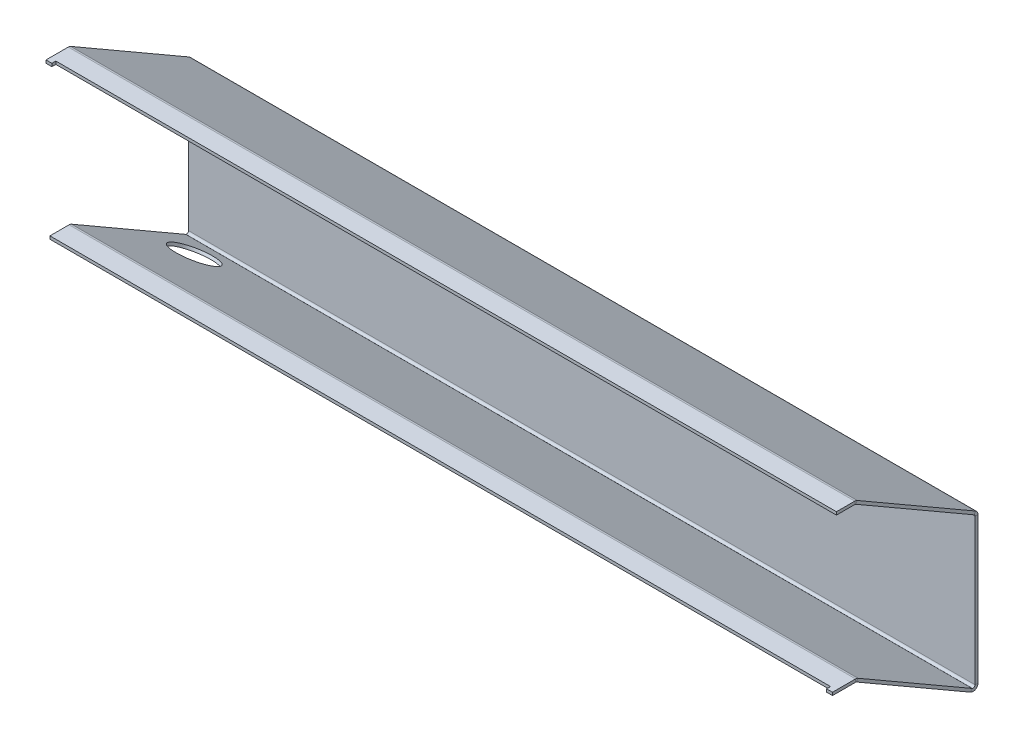
ISO-10303-21;
HEADER;
FILE_DESCRIPTION(('STEP AP214'),'2;1');
FILE_NAME('part.step','',(''),(''),'','','');
FILE_SCHEMA(('AUTOMOTIVE_DESIGN { 1 0 10303 214 1 1 1 1 }'));
ENDSEC;
DATA;
#1=APPLICATION_CONTEXT('core data for automotive mechanical design processes');
#2=APPLICATION_PROTOCOL_DEFINITION('international standard','automotive_design',2000,#1);
#3=PRODUCT_CONTEXT('',#1,'mechanical');
#4=PRODUCT('Part','Part','',(#3));
#5=PRODUCT_RELATED_PRODUCT_CATEGORY('part','',(#4));
#6=PRODUCT_DEFINITION_FORMATION('','',#4);
#7=PRODUCT_DEFINITION_CONTEXT('part definition',#1,'design');
#8=PRODUCT_DEFINITION('design','',#6,#7);
#9=PRODUCT_DEFINITION_SHAPE('','',#8);
#10=(LENGTH_UNIT() NAMED_UNIT(*) SI_UNIT(.MILLI.,.METRE.));
#11=(NAMED_UNIT(*) PLANE_ANGLE_UNIT() SI_UNIT($,.RADIAN.));
#12=(NAMED_UNIT(*) SI_UNIT($,.STERADIAN.) SOLID_ANGLE_UNIT());
#13=UNCERTAINTY_MEASURE_WITH_UNIT(LENGTH_MEASURE(1.E-05),#10,'distance_accuracy_value','');
#14=(GEOMETRIC_REPRESENTATION_CONTEXT(3) GLOBAL_UNCERTAINTY_ASSIGNED_CONTEXT((#13)) GLOBAL_UNIT_ASSIGNED_CONTEXT((#10,
#11,#12)) REPRESENTATION_CONTEXT('',''));
#15=CARTESIAN_POINT('',(0.,0.,0.));
#16=DIRECTION('',(0.,0.,1.));
#17=DIRECTION('',(1.,0.,0.));
#18=AXIS2_PLACEMENT_3D('',#15,#16,#17);
#19=CARTESIAN_POINT('',(-400.,0.,22.3567994977189));
#20=DIRECTION('',(0.,0.,-1.));
#21=DIRECTION('',(-1.,0.,0.));
#22=AXIS2_PLACEMENT_3D('',#19,#20,#21);
#23=PLANE('',#22);
#24=DIRECTION('',(0.,-1.,0.));
#25=VECTOR('',#24,1.);
#26=CARTESIAN_POINT('',(-3.,0.,22.3567994977189));
#27=LINE('',#26,#25);
#28=CARTESIAN_POINT('',(-3.,1.5,22.3567994977189));
#29=VERTEX_POINT('',#28);
#30=CARTESIAN_POINT('',(-3.,0.,22.3567994977189));
#31=VERTEX_POINT('',#30);
#32=EDGE_CURVE('E52',#29,#31,#27,.T.);
#33=ORIENTED_EDGE('',*,*,#32,.F.);
#34=DIRECTION('',(1.,0.,0.));
#35=VECTOR('',#34,1.);
#36=CARTESIAN_POINT('',(-400.,1.5,22.3567994977189));
#37=LINE('',#36,#35);
#38=CARTESIAN_POINT('',(-400.,1.5,22.3567994977189));
#39=VERTEX_POINT('',#38);
#40=EDGE_CURVE('E387',#39,#29,#37,.T.);
#41=ORIENTED_EDGE('',*,*,#40,.F.);
#42=DIRECTION('',(0.,1.,0.));
#43=VECTOR('',#42,1.);
#44=CARTESIAN_POINT('',(-400.,0.,22.3567994977189));
#45=LINE('',#44,#43);
#46=CARTESIAN_POINT('',(-400.,0.,22.3567994977189));
#47=VERTEX_POINT('',#46);
#48=EDGE_CURVE('E284',#47,#39,#45,.T.);
#49=ORIENTED_EDGE('',*,*,#48,.F.);
#50=DIRECTION('',(1.,0.,0.));
#51=VECTOR('',#50,1.);
#52=CARTESIAN_POINT('',(-400.,0.,22.3567994977189));
#53=LINE('',#52,#51);
#54=EDGE_CURVE('E385',#47,#31,#53,.T.);
#55=ORIENTED_EDGE('',*,*,#54,.T.);
#56=EDGE_LOOP('',(#33,#41,#49,#55));
#57=FACE_BOUND('',#56,.T.);
#58=ADVANCED_FACE('F37',(#57),#23,.F.);
#59=CARTESIAN_POINT('',(-400.,78.5,22.3567994977189));
#60=DIRECTION('',(0.,0.,-1.));
#61=DIRECTION('',(-1.,0.,0.));
#62=AXIS2_PLACEMENT_3D('',#59,#60,#61);
#63=PLANE('',#62);
#64=DIRECTION('',(0.,1.,0.));
#65=VECTOR('',#64,1.);
#66=CARTESIAN_POINT('',(-397.,80.,22.3567994977189));
#67=LINE('',#66,#65);
#68=CARTESIAN_POINT('',(-397.,78.5,22.3567994977189));
#69=VERTEX_POINT('',#68);
#70=CARTESIAN_POINT('',(-397.,80.,22.3567994977189));
#71=VERTEX_POINT('',#70);
#72=EDGE_CURVE('E60',#69,#71,#67,.T.);
#73=ORIENTED_EDGE('',*,*,#72,.F.);
#74=DIRECTION('',(1.,0.,0.));
#75=VECTOR('',#74,1.);
#76=CARTESIAN_POINT('',(-400.,78.5,22.3567994977189));
#77=LINE('',#76,#75);
#78=CARTESIAN_POINT('',(0.,78.5,22.3567994977189));
#79=VERTEX_POINT('',#78);
#80=EDGE_CURVE('E412',#69,#79,#77,.T.);
#81=ORIENTED_EDGE('',*,*,#80,.T.);
#82=DIRECTION('',(0.,1.,0.));
#83=VECTOR('',#82,1.);
#84=CARTESIAN_POINT('',(0.,78.5,22.3567994977189));
#85=LINE('',#84,#83);
#86=CARTESIAN_POINT('',(0.,80.,22.3567994977189));
#87=VERTEX_POINT('',#86);
#88=EDGE_CURVE('E313',#79,#87,#85,.T.);
#89=ORIENTED_EDGE('',*,*,#88,.T.);
#90=DIRECTION('',(1.,0.,0.));
#91=VECTOR('',#90,1.);
#92=CARTESIAN_POINT('',(-400.,80.,22.3567994977189));
#93=LINE('',#92,#91);
#94=EDGE_CURVE('E310',#71,#87,#93,.T.);
#95=ORIENTED_EDGE('',*,*,#94,.F.);
#96=EDGE_LOOP('',(#73,#81,#89,#95));
#97=FACE_BOUND('',#96,.T.);
#98=ADVANCED_FACE('F529',(#97),#63,.F.);
#99=CARTESIAN_POINT('',(-400.,-0.133974596215558,12.12474869015));
#100=DIRECTION('',(-1.,0.,0.));
#101=DIRECTION('',(0.,0.,1.));
#102=AXIS2_PLACEMENT_3D('',#99,#100,#101);
#103=PLANE('',#102);
#104=DIRECTION('',(0.,0.86602540378444,-0.499999999999997));
#105=VECTOR('',#104,1.);
#106=CARTESIAN_POINT('',(-400.,-0.133974596215558,12.12474869015));
#107=LINE('',#106,#105);
#108=CARTESIAN_POINT('',(-400.,-0.133974596215558,12.12474869015));
#109=VERTEX_POINT('',#108);
#110=CARTESIAN_POINT('',(-400.,1.1650635094611,11.37474869015));
#111=VERTEX_POINT('',#110);
#112=EDGE_CURVE('E11',#109,#111,#107,.T.);
#113=ORIENTED_EDGE('',*,*,#112,.F.);
#114=CARTESIAN_POINT('',(-400.,-0.999999999999999,12.62474869015));
#115=DIRECTION('',(1.,0.,0.));
#116=DIRECTION('',(0.,0.,-1.));
#117=AXIS2_PLACEMENT_3D('',#114,#115,#116);
#118=CIRCLE('',#117,1.);
#119=CARTESIAN_POINT('',(-400.,0.,12.62474869015));
#120=VERTEX_POINT('',#119);
#121=EDGE_CURVE('E289',#120,#109,#118,.F.);
#122=ORIENTED_EDGE('',*,*,#121,.F.);
#123=DIRECTION('',(0.,-1.,0.));
#124=VECTOR('',#123,1.);
#125=CARTESIAN_POINT('',(-400.,1.5,12.62474869015));
#126=LINE('',#125,#124);
#127=CARTESIAN_POINT('',(-400.,1.5,12.62474869015));
#128=VERTEX_POINT('',#127);
#129=EDGE_CURVE('E45',#128,#120,#126,.T.);
#130=ORIENTED_EDGE('',*,*,#129,.F.);
#131=CARTESIAN_POINT('',(-400.,-0.999999999999999,12.62474869015));
#132=DIRECTION('',(1.,0.,0.));
#133=DIRECTION('',(0.,0.,-1.));
#134=AXIS2_PLACEMENT_3D('',#131,#132,#133);
#135=CIRCLE('',#134,2.5);
#136=EDGE_CURVE('E278',#128,#111,#135,.F.);
#137=ORIENTED_EDGE('',*,*,#136,.T.);
#138=EDGE_LOOP('',(#113,#122,#130,#137));
#139=FACE_BOUND('',#138,.T.);
#140=ADVANCED_FACE('F39',(#139),#103,.T.);
#141=CARTESIAN_POINT('',(-400.,1.5,12.62474869015));
#142=DIRECTION('',(-1.,0.,0.));
#143=DIRECTION('',(0.,0.,1.));
#144=AXIS2_PLACEMENT_3D('',#141,#142,#143);
#145=PLANE('',#144);
#146=DIRECTION('',(0.,-0.499999999999998,-0.86602540378444));
#147=VECTOR('',#146,1.);
#148=CARTESIAN_POINT('',(-400.,0.,12.3567994977189));
#149=LINE('',#148,#147);
#150=CARTESIAN_POINT('',(-400.,-33.6306531802955,-45.8932005022811));
#151=VERTEX_POINT('',#150);
#152=EDGE_CURVE('E292',#109,#151,#149,.T.);
#153=ORIENTED_EDGE('',*,*,#152,.F.);
#154=ORIENTED_EDGE('',*,*,#112,.T.);
#155=DIRECTION('',(0.,-0.499999999999998,-0.86602540378444));
#156=VECTOR('',#155,1.);
#157=CARTESIAN_POINT('',(-400.,1.29903810567666,11.6067994977189));
#158=LINE('',#157,#156);
#159=CARTESIAN_POINT('',(-400.,-32.3316150746188,-46.6432005022811));
#160=VERTEX_POINT('',#159);
#161=EDGE_CURVE('E275',#111,#160,#158,.T.);
#162=ORIENTED_EDGE('',*,*,#161,.T.);
#163=DIRECTION('',(0.,-0.86602540378444,0.499999999999997));
#164=VECTOR('',#163,1.);
#165=CARTESIAN_POINT('',(-400.,-32.3316150746188,-46.6432005022811));
#166=LINE('',#165,#164);
#167=EDGE_CURVE('E434',#160,#151,#166,.T.);
#168=ORIENTED_EDGE('',*,*,#167,.T.);
#169=EDGE_LOOP('',(#153,#154,#162,#168));
#170=FACE_BOUND('',#169,.T.);
#171=ADVANCED_FACE('F468',(#170),#145,.T.);
#172=CARTESIAN_POINT('',(0.,0.,12.62474869015));
#173=DIRECTION('',(1.,0.,0.));
#174=DIRECTION('',(0.,0.,-1.));
#175=AXIS2_PLACEMENT_3D('',#172,#173,#174);
#176=PLANE('',#175);
#177=DIRECTION('',(0.,1.,0.));
#178=VECTOR('',#177,1.);
#179=CARTESIAN_POINT('',(0.,0.,12.62474869015));
#180=LINE('',#179,#178);
#181=CARTESIAN_POINT('',(0.,0.,12.62474869015));
#182=VERTEX_POINT('',#181);
#183=CARTESIAN_POINT('',(0.,1.5,12.62474869015));
#184=VERTEX_POINT('',#183);
#185=EDGE_CURVE('E204',#182,#184,#180,.T.);
#186=ORIENTED_EDGE('',*,*,#185,.F.);
#187=CARTESIAN_POINT('',(0.,-0.999999999999999,12.62474869015));
#188=DIRECTION('',(1.,0.,0.));
#189=DIRECTION('',(0.,0.,-1.));
#190=AXIS2_PLACEMENT_3D('',#187,#188,#189);
#191=CIRCLE('',#190,1.);
#192=CARTESIAN_POINT('',(0.,-0.133974596215558,12.12474869015));
#193=VERTEX_POINT('',#192);
#194=EDGE_CURVE('E340',#182,#193,#191,.F.);
#195=ORIENTED_EDGE('',*,*,#194,.T.);
#196=DIRECTION('',(0.,-0.86602540378444,0.499999999999997));
#197=VECTOR('',#196,1.);
#198=CARTESIAN_POINT('',(0.,1.1650635094611,11.37474869015));
#199=LINE('',#198,#197);
#200=CARTESIAN_POINT('',(0.,1.1650635094611,11.37474869015));
#201=VERTEX_POINT('',#200);
#202=EDGE_CURVE('E438',#201,#193,#199,.T.);
#203=ORIENTED_EDGE('',*,*,#202,.F.);
#204=CARTESIAN_POINT('',(0.,-0.999999999999999,12.62474869015));
#205=DIRECTION('',(1.,0.,0.));
#206=DIRECTION('',(0.,0.,-1.));
#207=AXIS2_PLACEMENT_3D('',#204,#205,#206);
#208=CIRCLE('',#207,2.5);
#209=EDGE_CURVE('E209',#184,#201,#208,.F.);
#210=ORIENTED_EDGE('',*,*,#209,.F.);
#211=EDGE_LOOP('',(#186,#195,#203,#210));
#212=FACE_BOUND('',#211,.T.);
#213=ADVANCED_FACE('F476',(#212),#176,.T.);
#214=CARTESIAN_POINT('',(0.,1.1650635094611,11.37474869015));
#215=DIRECTION('',(1.,0.,0.));
#216=DIRECTION('',(0.,0.,-1.));
#217=AXIS2_PLACEMENT_3D('',#214,#215,#216);
#218=PLANE('',#217);
#219=DIRECTION('',(0.,0.,-1.));
#220=VECTOR('',#219,1.);
#221=CARTESIAN_POINT('',(0.,0.,12.3567994977189));
#222=LINE('',#221,#220);
#223=CARTESIAN_POINT('',(0.,0.,24.3567994977189));
#224=VERTEX_POINT('',#223);
#225=EDGE_CURVE('E208',#224,#182,#222,.T.);
#226=ORIENTED_EDGE('',*,*,#225,.T.);
#227=ORIENTED_EDGE('',*,*,#185,.T.);
#228=DIRECTION('',(0.,0.,-1.));
#229=VECTOR('',#228,1.);
#230=CARTESIAN_POINT('',(0.,1.5,12.3567994977189));
#231=LINE('',#230,#229);
#232=CARTESIAN_POINT('',(0.,1.5,24.3567994977189));
#233=VERTEX_POINT('',#232);
#234=EDGE_CURVE('E198',#233,#184,#231,.T.);
#235=ORIENTED_EDGE('',*,*,#234,.F.);
#236=DIRECTION('',(0.,1.,0.));
#237=VECTOR('',#236,1.);
#238=CARTESIAN_POINT('',(0.,0.,24.3567994977189));
#239=LINE('',#238,#237);
#240=EDGE_CURVE('E203',#224,#233,#239,.T.);
#241=ORIENTED_EDGE('',*,*,#240,.F.);
#242=EDGE_LOOP('',(#226,#227,#235,#241));
#243=FACE_BOUND('',#242,.T.);
#244=ADVANCED_FACE('F201',(#243),#218,.T.);
#245=CARTESIAN_POINT('',(-400.,-31.4655896708344,-49.6432005022811));
#246=DIRECTION('',(-1.,0.,0.));
#247=DIRECTION('',(0.,0.,1.));
#248=AXIS2_PLACEMENT_3D('',#245,#246,#247);
#249=PLANE('',#248);
#250=DIRECTION('',(0.,0.,1.));
#251=VECTOR('',#250,1.);
#252=CARTESIAN_POINT('',(-400.,-31.4655896708344,-49.6432005022811));
#253=LINE('',#252,#251);
#254=CARTESIAN_POINT('',(-400.,-31.4655896708344,-49.6432005022811));
#255=VERTEX_POINT('',#254);
#256=CARTESIAN_POINT('',(-400.,-31.4655896708344,-48.1432005022811));
#257=VERTEX_POINT('',#256);
#258=EDGE_CURVE('E436',#255,#257,#253,.T.);
#259=ORIENTED_EDGE('',*,*,#258,.F.);
#260=CARTESIAN_POINT('',(-400.,-31.4655896708344,-47.1432005022811));
#261=DIRECTION('',(-1.,0.,0.));
#262=DIRECTION('',(0.,0.,1.));
#263=AXIS2_PLACEMENT_3D('',#260,#261,#262);
#264=CIRCLE('',#263,2.5);
#265=EDGE_CURVE('E295',#151,#255,#264,.F.);
#266=ORIENTED_EDGE('',*,*,#265,.F.);
#267=ORIENTED_EDGE('',*,*,#167,.F.);
#268=CARTESIAN_POINT('',(-400.,-31.4655896708344,-47.1432005022811));
#269=DIRECTION('',(1.,0.,0.));
#270=DIRECTION('',(0.,0.,-1.));
#271=AXIS2_PLACEMENT_3D('',#268,#269,#270);
#272=CIRCLE('',#271,1.);
#273=EDGE_CURVE('E272',#160,#257,#272,.T.);
#274=ORIENTED_EDGE('',*,*,#273,.T.);
#275=EDGE_LOOP('',(#259,#266,#267,#274));
#276=FACE_BOUND('',#275,.T.);
#277=ADVANCED_FACE('F519',(#276),#249,.T.);
#278=CARTESIAN_POINT('',(-400.,-32.3316150746188,-46.6432005022811));
#279=DIRECTION('',(-1.,0.,0.));
#280=DIRECTION('',(0.,0.,1.));
#281=AXIS2_PLACEMENT_3D('',#278,#279,#280);
#282=PLANE('',#281);
#283=DIRECTION('',(0.,1.,0.));
#284=VECTOR('',#283,1.);
#285=CARTESIAN_POINT('',(-400.,-35.7957166897566,-49.6432005022811));
#286=LINE('',#285,#284);
#287=CARTESIAN_POINT('',(-400.,42.7609076372694,-49.6432005022811));
#288=VERTEX_POINT('',#287);
#289=EDGE_CURVE('E298',#255,#288,#286,.T.);
#290=ORIENTED_EDGE('',*,*,#289,.F.);
#291=ORIENTED_EDGE('',*,*,#258,.T.);
#292=DIRECTION('',(0.,1.,0.));
#293=VECTOR('',#292,1.);
#294=CARTESIAN_POINT('',(-400.,-35.7957166897566,-48.1432005022811));
#295=LINE('',#294,#293);
#296=CARTESIAN_POINT('',(-400.,42.7609076372694,-48.1432005022811));
#297=VERTEX_POINT('',#296);
#298=EDGE_CURVE('E269',#257,#297,#295,.T.);
#299=ORIENTED_EDGE('',*,*,#298,.T.);
#300=DIRECTION('',(0.,0.,-1.));
#301=VECTOR('',#300,1.);
#302=CARTESIAN_POINT('',(-400.,42.7609076372694,-48.1432005022811));
#303=LINE('',#302,#301);
#304=EDGE_CURVE('E426',#297,#288,#303,.T.);
#305=ORIENTED_EDGE('',*,*,#304,.T.);
#306=EDGE_LOOP('',(#290,#291,#299,#305));
#307=FACE_BOUND('',#306,.T.);
#308=ADVANCED_FACE('F517',(#307),#282,.T.);
#309=CARTESIAN_POINT('',(0.,-33.6306531802955,-45.8932005022811));
#310=DIRECTION('',(1.,0.,0.));
#311=DIRECTION('',(0.,0.,-1.));
#312=AXIS2_PLACEMENT_3D('',#309,#310,#311);
#313=PLANE('',#312);
#314=DIRECTION('',(0.,0.86602540378444,-0.499999999999997));
#315=VECTOR('',#314,1.);
#316=CARTESIAN_POINT('',(0.,-33.6306531802955,-45.8932005022811));
#317=LINE('',#316,#315);
#318=CARTESIAN_POINT('',(0.,-33.6306531802955,-45.8932005022811));
#319=VERTEX_POINT('',#318);
#320=CARTESIAN_POINT('',(0.,-32.3316150746188,-46.6432005022811));
#321=VERTEX_POINT('',#320);
#322=EDGE_CURVE('E432',#319,#321,#317,.T.);
#323=ORIENTED_EDGE('',*,*,#322,.F.);
#324=CARTESIAN_POINT('',(0.,-31.4655896708344,-47.1432005022811));
#325=DIRECTION('',(-1.,0.,0.));
#326=DIRECTION('',(0.,0.,1.));
#327=AXIS2_PLACEMENT_3D('',#324,#325,#326);
#328=CIRCLE('',#327,2.5);
#329=CARTESIAN_POINT('',(0.,-31.4655896708344,-49.6432005022811));
#330=VERTEX_POINT('',#329);
#331=EDGE_CURVE('E346',#319,#330,#328,.F.);
#332=ORIENTED_EDGE('',*,*,#331,.T.);
#333=DIRECTION('',(0.,0.,-1.));
#334=VECTOR('',#333,1.);
#335=CARTESIAN_POINT('',(0.,-31.4655896708344,-48.1432005022811));
#336=LINE('',#335,#334);
#337=CARTESIAN_POINT('',(0.,-31.4655896708344,-48.1432005022811));
#338=VERTEX_POINT('',#337);
#339=EDGE_CURVE('E430',#338,#330,#336,.T.);
#340=ORIENTED_EDGE('',*,*,#339,.F.);
#341=CARTESIAN_POINT('',(0.,-31.4655896708344,-47.1432005022811));
#342=DIRECTION('',(1.,0.,0.));
#343=DIRECTION('',(0.,0.,-1.));
#344=AXIS2_PLACEMENT_3D('',#341,#342,#343);
#345=CIRCLE('',#344,1.);
#346=EDGE_CURVE('E331',#321,#338,#345,.T.);
#347=ORIENTED_EDGE('',*,*,#346,.F.);
#348=EDGE_LOOP('',(#323,#332,#340,#347));
#349=FACE_BOUND('',#348,.T.);
#350=ADVANCED_FACE('F483',(#349),#313,.T.);
#351=CARTESIAN_POINT('',(0.,-31.4655896708344,-48.1432005022811));
#352=DIRECTION('',(1.,0.,0.));
#353=DIRECTION('',(0.,0.,-1.));
#354=AXIS2_PLACEMENT_3D('',#351,#352,#353);
#355=PLANE('',#354);
#356=DIRECTION('',(0.,-0.499999999999998,-0.86602540378444));
#357=VECTOR('',#356,1.);
#358=CARTESIAN_POINT('',(0.,0.,12.3567994977189));
#359=LINE('',#358,#357);
#360=EDGE_CURVE('E343',#193,#319,#359,.T.);
#361=ORIENTED_EDGE('',*,*,#360,.T.);
#362=ORIENTED_EDGE('',*,*,#322,.T.);
#363=DIRECTION('',(0.,-0.499999999999998,-0.86602540378444));
#364=VECTOR('',#363,1.);
#365=CARTESIAN_POINT('',(0.,1.29903810567666,11.6067994977189));
#366=LINE('',#365,#364);
#367=EDGE_CURVE('E334',#201,#321,#366,.T.);
#368=ORIENTED_EDGE('',*,*,#367,.F.);
#369=ORIENTED_EDGE('',*,*,#202,.T.);
#370=EDGE_LOOP('',(#361,#362,#368,#369));
#371=FACE_BOUND('',#370,.T.);
#372=ADVANCED_FACE('F477',(#371),#355,.T.);
#373=CARTESIAN_POINT('',(-400.,44.9259711467305,-48.3932005022811));
#374=DIRECTION('',(-1.,0.,0.));
#375=DIRECTION('',(0.,0.,1.));
#376=AXIS2_PLACEMENT_3D('',#373,#374,#375);
#377=PLANE('',#376);
#378=DIRECTION('',(0.,-0.86602540378444,0.499999999999997));
#379=VECTOR('',#378,1.);
#380=CARTESIAN_POINT('',(-400.,44.9259711467305,-48.3932005022811));
#381=LINE('',#380,#379);
#382=CARTESIAN_POINT('',(-400.,44.9259711467305,-48.3932005022811));
#383=VERTEX_POINT('',#382);
#384=CARTESIAN_POINT('',(-400.,43.6269330410538,-47.6432005022811));
#385=VERTEX_POINT('',#384);
#386=EDGE_CURVE('E428',#383,#385,#381,.T.);
#387=ORIENTED_EDGE('',*,*,#386,.F.);
#388=CARTESIAN_POINT('',(-400.,42.7609076372694,-47.1432005022811));
#389=DIRECTION('',(-1.,0.,0.));
#390=DIRECTION('',(0.,0.,1.));
#391=AXIS2_PLACEMENT_3D('',#388,#389,#390);
#392=CIRCLE('',#391,2.5);
#393=EDGE_CURVE('E301',#288,#383,#392,.F.);
#394=ORIENTED_EDGE('',*,*,#393,.F.);
#395=ORIENTED_EDGE('',*,*,#304,.F.);
#396=CARTESIAN_POINT('',(-400.,42.7609076372694,-47.1432005022811));
#397=DIRECTION('',(1.,0.,0.));
#398=DIRECTION('',(0.,0.,-1.));
#399=AXIS2_PLACEMENT_3D('',#396,#397,#398);
#400=CIRCLE('',#399,1.);
#401=EDGE_CURVE('E266',#297,#385,#400,.T.);
#402=ORIENTED_EDGE('',*,*,#401,.T.);
#403=EDGE_LOOP('',(#387,#394,#395,#402));
#404=FACE_BOUND('',#403,.T.);
#405=ADVANCED_FACE('F515',(#404),#377,.T.);
#406=CARTESIAN_POINT('',(-400.,42.7609076372694,-48.1432005022811));
#407=DIRECTION('',(-1.,0.,0.));
#408=DIRECTION('',(0.,0.,1.));
#409=AXIS2_PLACEMENT_3D('',#406,#407,#408);
#410=PLANE('',#409);
#411=DIRECTION('',(0.,0.499999999999998,0.86602540378444));
#412=VECTOR('',#411,1.);
#413=CARTESIAN_POINT('',(-400.,44.2042833102434,-49.6432005022811));
#414=LINE('',#413,#412);
#415=CARTESIAN_POINT('',(-400.,79.6650635094611,11.7766724787967));
#416=VERTEX_POINT('',#415);
#417=EDGE_CURVE('E304',#383,#416,#414,.T.);
#418=ORIENTED_EDGE('',*,*,#417,.F.);
#419=ORIENTED_EDGE('',*,*,#386,.T.);
#420=DIRECTION('',(0.,0.499999999999998,0.86602540378444));
#421=VECTOR('',#420,1.);
#422=CARTESIAN_POINT('',(-400.,42.9052452045668,-48.8932005022811));
#423=LINE('',#422,#421);
#424=CARTESIAN_POINT('',(-400.,78.3660254037844,12.5266724787967));
#425=VERTEX_POINT('',#424);
#426=EDGE_CURVE('E263',#385,#425,#423,.T.);
#427=ORIENTED_EDGE('',*,*,#426,.T.);
#428=DIRECTION('',(0.,0.866025403784441,-0.499999999999997));
#429=VECTOR('',#428,1.);
#430=CARTESIAN_POINT('',(-400.,78.3660254037844,12.5266724787967));
#431=LINE('',#430,#429);
#432=EDGE_CURVE('E418',#425,#416,#431,.T.);
#433=ORIENTED_EDGE('',*,*,#432,.T.);
#434=EDGE_LOOP('',(#418,#419,#427,#433));
#435=FACE_BOUND('',#434,.T.);
#436=ADVANCED_FACE('F588',(#435),#410,.T.);
#437=CARTESIAN_POINT('',(0.,42.7609076372694,-49.6432005022811));
#438=DIRECTION('',(1.,0.,0.));
#439=DIRECTION('',(0.,0.,-1.));
#440=AXIS2_PLACEMENT_3D('',#437,#438,#439);
#441=PLANE('',#440);
#442=DIRECTION('',(0.,0.,1.));
#443=VECTOR('',#442,1.);
#444=CARTESIAN_POINT('',(0.,42.7609076372694,-49.6432005022811));
#445=LINE('',#444,#443);
#446=CARTESIAN_POINT('',(0.,42.7609076372694,-49.6432005022811));
#447=VERTEX_POINT('',#446);
#448=CARTESIAN_POINT('',(0.,42.7609076372694,-48.1432005022811));
#449=VERTEX_POINT('',#448);
#450=EDGE_CURVE('E424',#447,#449,#445,.T.);
#451=ORIENTED_EDGE('',*,*,#450,.F.);
#452=CARTESIAN_POINT('',(0.,42.7609076372694,-47.1432005022811));
#453=DIRECTION('',(-1.,0.,0.));
#454=DIRECTION('',(0.,0.,1.));
#455=AXIS2_PLACEMENT_3D('',#452,#453,#454);
#456=CIRCLE('',#455,2.5);
#457=CARTESIAN_POINT('',(0.,44.9259711467305,-48.3932005022811));
#458=VERTEX_POINT('',#457);
#459=EDGE_CURVE('E352',#447,#458,#456,.F.);
#460=ORIENTED_EDGE('',*,*,#459,.T.);
#461=DIRECTION('',(0.,0.86602540378444,-0.499999999999997));
#462=VECTOR('',#461,1.);
#463=CARTESIAN_POINT('',(0.,43.6269330410538,-47.6432005022811));
#464=LINE('',#463,#462);
#465=CARTESIAN_POINT('',(0.,43.6269330410538,-47.6432005022811));
#466=VERTEX_POINT('',#465);
#467=EDGE_CURVE('E422',#466,#458,#464,.T.);
#468=ORIENTED_EDGE('',*,*,#467,.F.);
#469=CARTESIAN_POINT('',(0.,42.7609076372694,-47.1432005022811));
#470=DIRECTION('',(1.,0.,0.));
#471=DIRECTION('',(0.,0.,-1.));
#472=AXIS2_PLACEMENT_3D('',#469,#470,#471);
#473=CIRCLE('',#472,1.);
#474=EDGE_CURVE('E325',#449,#466,#473,.T.);
#475=ORIENTED_EDGE('',*,*,#474,.F.);
#476=EDGE_LOOP('',(#451,#460,#468,#475));
#477=FACE_BOUND('',#476,.T.);
#478=ADVANCED_FACE('F503',(#477),#441,.T.);
#479=CARTESIAN_POINT('',(0.,43.6269330410538,-47.6432005022811));
#480=DIRECTION('',(1.,0.,0.));
#481=DIRECTION('',(0.,0.,-1.));
#482=AXIS2_PLACEMENT_3D('',#479,#480,#481);
#483=PLANE('',#482);
#484=DIRECTION('',(0.,1.,0.));
#485=VECTOR('',#484,1.);
#486=CARTESIAN_POINT('',(0.,-35.7957166897566,-49.6432005022811));
#487=LINE('',#486,#485);
#488=EDGE_CURVE('E349',#330,#447,#487,.T.);
#489=ORIENTED_EDGE('',*,*,#488,.T.);
#490=ORIENTED_EDGE('',*,*,#450,.T.);
#491=DIRECTION('',(0.,1.,0.));
#492=VECTOR('',#491,1.);
#493=CARTESIAN_POINT('',(0.,-35.7957166897566,-48.1432005022811));
#494=LINE('',#493,#492);
#495=EDGE_CURVE('E328',#338,#449,#494,.T.);
#496=ORIENTED_EDGE('',*,*,#495,.F.);
#497=ORIENTED_EDGE('',*,*,#339,.T.);
#498=EDGE_LOOP('',(#489,#490,#496,#497));
#499=FACE_BOUND('',#498,.T.);
#500=ADVANCED_FACE('F486',(#499),#483,.T.);
#501=CARTESIAN_POINT('',(-400.,80.,13.0266724787967));
#502=DIRECTION('',(-1.,0.,0.));
#503=DIRECTION('',(0.,0.,1.));
#504=AXIS2_PLACEMENT_3D('',#501,#502,#503);
#505=PLANE('',#504);
#506=DIRECTION('',(0.,-1.,0.));
#507=VECTOR('',#506,1.);
#508=CARTESIAN_POINT('',(-400.,80.,13.0266724787967));
#509=LINE('',#508,#507);
#510=CARTESIAN_POINT('',(-400.,80.,13.0266724787967));
#511=VERTEX_POINT('',#510);
#512=CARTESIAN_POINT('',(-400.,78.5,13.0266724787967));
#513=VERTEX_POINT('',#512);
#514=EDGE_CURVE('E420',#511,#513,#509,.T.);
#515=ORIENTED_EDGE('',*,*,#514,.F.);
#516=CARTESIAN_POINT('',(-400.,77.5,13.0266724787967));
#517=DIRECTION('',(-1.,0.,0.));
#518=DIRECTION('',(0.,0.,1.));
#519=AXIS2_PLACEMENT_3D('',#516,#517,#518);
#520=CIRCLE('',#519,2.5);
#521=EDGE_CURVE('E307',#416,#511,#520,.F.);
#522=ORIENTED_EDGE('',*,*,#521,.F.);
#523=ORIENTED_EDGE('',*,*,#432,.F.);
#524=CARTESIAN_POINT('',(-400.,77.5,13.0266724787967));
#525=DIRECTION('',(1.,0.,0.));
#526=DIRECTION('',(0.,0.,-1.));
#527=AXIS2_PLACEMENT_3D('',#524,#525,#526);
#528=CIRCLE('',#527,1.);
#529=EDGE_CURVE('E260',#425,#513,#528,.T.);
#530=ORIENTED_EDGE('',*,*,#529,.T.);
#531=EDGE_LOOP('',(#515,#522,#523,#530));
#532=FACE_BOUND('',#531,.T.);
#533=ADVANCED_FACE('F579',(#532),#505,.T.);
#534=CARTESIAN_POINT('',(-400.,78.3660254037844,12.5266724787967));
#535=DIRECTION('',(-1.,0.,0.));
#536=DIRECTION('',(0.,0.,1.));
#537=AXIS2_PLACEMENT_3D('',#534,#535,#536);
#538=PLANE('',#537);
#539=DIRECTION('',(0.,0.,1.));
#540=VECTOR('',#539,1.);
#541=CARTESIAN_POINT('',(-400.,80.,12.3567994977189));
#542=LINE('',#541,#540);
#543=CARTESIAN_POINT('',(-400.,80.,24.3567994977189));
#544=VERTEX_POINT('',#543);
#545=EDGE_CURVE('E255',#511,#544,#542,.T.);
#546=ORIENTED_EDGE('',*,*,#545,.F.);
#547=ORIENTED_EDGE('',*,*,#514,.T.);
#548=DIRECTION('',(0.,0.,-1.));
#549=VECTOR('',#548,1.);
#550=CARTESIAN_POINT('',(-400.,78.5,12.3567994977189));
#551=LINE('',#550,#549);
#552=CARTESIAN_POINT('',(-400.,78.5,24.3567994977189));
#553=VERTEX_POINT('',#552);
#554=EDGE_CURVE('E257',#513,#553,#551,.F.);
#555=ORIENTED_EDGE('',*,*,#554,.T.);
#556=DIRECTION('',(0.,-1.,0.));
#557=VECTOR('',#556,1.);
#558=CARTESIAN_POINT('',(-400.,80.,24.3567994977189));
#559=LINE('',#558,#557);
#560=EDGE_CURVE('E237',#544,#553,#559,.T.);
#561=ORIENTED_EDGE('',*,*,#560,.F.);
#562=EDGE_LOOP('',(#546,#547,#555,#561));
#563=FACE_BOUND('',#562,.T.);
#564=ADVANCED_FACE('F575',(#563),#538,.T.);
#565=CARTESIAN_POINT('',(0.,79.6650635094611,11.7766724787967));
#566=DIRECTION('',(1.,0.,0.));
#567=DIRECTION('',(0.,0.,-1.));
#568=AXIS2_PLACEMENT_3D('',#565,#566,#567);
#569=PLANE('',#568);
#570=DIRECTION('',(0.,-0.866025403784441,0.499999999999997));
#571=VECTOR('',#570,1.);
#572=CARTESIAN_POINT('',(0.,79.6650635094611,11.7766724787967));
#573=LINE('',#572,#571);
#574=CARTESIAN_POINT('',(0.,79.6650635094611,11.7766724787967));
#575=VERTEX_POINT('',#574);
#576=CARTESIAN_POINT('',(0.,78.3660254037844,12.5266724787967));
#577=VERTEX_POINT('',#576);
#578=EDGE_CURVE('E416',#575,#577,#573,.T.);
#579=ORIENTED_EDGE('',*,*,#578,.F.);
#580=CARTESIAN_POINT('',(0.,77.5,13.0266724787967));
#581=DIRECTION('',(-1.,0.,0.));
#582=DIRECTION('',(0.,0.,1.));
#583=AXIS2_PLACEMENT_3D('',#580,#581,#582);
#584=CIRCLE('',#583,2.5);
#585=CARTESIAN_POINT('',(0.,80.,13.0266724787967));
#586=VERTEX_POINT('',#585);
#587=EDGE_CURVE('E258',#575,#586,#584,.F.);
#588=ORIENTED_EDGE('',*,*,#587,.T.);
#589=DIRECTION('',(0.,1.,0.));
#590=VECTOR('',#589,1.);
#591=CARTESIAN_POINT('',(0.,78.5,13.0266724787967));
#592=LINE('',#591,#590);
#593=CARTESIAN_POINT('',(0.,78.5,13.0266724787967));
#594=VERTEX_POINT('',#593);
#595=EDGE_CURVE('E363',#594,#586,#592,.T.);
#596=ORIENTED_EDGE('',*,*,#595,.F.);
#597=CARTESIAN_POINT('',(0.,77.5,13.0266724787967));
#598=DIRECTION('',(1.,0.,0.));
#599=DIRECTION('',(0.,0.,-1.));
#600=AXIS2_PLACEMENT_3D('',#597,#598,#599);
#601=CIRCLE('',#600,1.);
#602=EDGE_CURVE('E319',#577,#594,#601,.T.);
#603=ORIENTED_EDGE('',*,*,#602,.F.);
#604=EDGE_LOOP('',(#579,#588,#596,#603));
#605=FACE_BOUND('',#604,.T.);
#606=ADVANCED_FACE('F571',(#605),#569,.T.);
#607=CARTESIAN_POINT('',(0.,78.5,13.0266724787967));
#608=DIRECTION('',(1.,0.,0.));
#609=DIRECTION('',(0.,0.,-1.));
#610=AXIS2_PLACEMENT_3D('',#607,#608,#609);
#611=PLANE('',#610);
#612=DIRECTION('',(0.,0.499999999999998,0.86602540378444));
#613=VECTOR('',#612,1.);
#614=CARTESIAN_POINT('',(0.,44.2042833102434,-49.6432005022811));
#615=LINE('',#614,#613);
#616=EDGE_CURVE('E355',#458,#575,#615,.T.);
#617=ORIENTED_EDGE('',*,*,#616,.T.);
#618=ORIENTED_EDGE('',*,*,#578,.T.);
#619=DIRECTION('',(0.,0.499999999999998,0.86602540378444));
#620=VECTOR('',#619,1.);
#621=CARTESIAN_POINT('',(0.,42.9052452045668,-48.8932005022811));
#622=LINE('',#621,#620);
#623=EDGE_CURVE('E322',#466,#577,#622,.T.);
#624=ORIENTED_EDGE('',*,*,#623,.F.);
#625=ORIENTED_EDGE('',*,*,#467,.T.);
#626=EDGE_LOOP('',(#617,#618,#624,#625));
#627=FACE_BOUND('',#626,.T.);
#628=ADVANCED_FACE('F567',(#627),#611,.T.);
#629=CARTESIAN_POINT('',(-400.,80.,12.3567994977189));
#630=DIRECTION('',(0.,1.,0.));
#631=DIRECTION('',(0.,0.,1.));
#632=AXIS2_PLACEMENT_3D('',#629,#630,#631);
#633=PLANE('',#632);
#634=DIRECTION('',(0.,0.,1.));
#635=VECTOR('',#634,1.);
#636=CARTESIAN_POINT('',(0.,80.,12.3567994977189));
#637=LINE('',#636,#635);
#638=EDGE_CURVE('E254',#586,#87,#637,.T.);
#639=ORIENTED_EDGE('',*,*,#638,.F.);
#640=DIRECTION('',(1.,0.,0.));
#641=VECTOR('',#640,1.);
#642=CARTESIAN_POINT('',(-400.,80.,13.0266724787967));
#643=LINE('',#642,#641);
#644=EDGE_CURVE('E360',#511,#586,#643,.T.);
#645=ORIENTED_EDGE('',*,*,#644,.F.);
#646=ORIENTED_EDGE('',*,*,#545,.T.);
#647=DIRECTION('',(-1.,0.,0.));
#648=VECTOR('',#647,1.);
#649=CARTESIAN_POINT('',(-400.,80.,24.3567994977189));
#650=LINE('',#649,#648);
#651=CARTESIAN_POINT('',(-397.,80.,24.3567994977189));
#652=VERTEX_POINT('',#651);
#653=EDGE_CURVE('E244',#652,#544,#650,.T.);
#654=ORIENTED_EDGE('',*,*,#653,.F.);
#655=DIRECTION('',(0.,0.,-1.));
#656=VECTOR('',#655,1.);
#657=CARTESIAN_POINT('',(-397.,80.,24.3567994977189));
#658=LINE('',#657,#656);
#659=EDGE_CURVE('E247',#652,#71,#658,.T.);
#660=ORIENTED_EDGE('',*,*,#659,.T.);
#661=ORIENTED_EDGE('',*,*,#94,.T.);
#662=EDGE_LOOP('',(#639,#645,#646,#654,#660,#661));
#663=FACE_BOUND('',#662,.T.);
#664=ADVANCED_FACE('F563',(#663),#633,.T.);
#665=CARTESIAN_POINT('',(-400.,77.5,13.0266724787967));
#666=DIRECTION('',(1.,0.,0.));
#667=DIRECTION('',(0.,0.,-1.));
#668=AXIS2_PLACEMENT_3D('',#665,#666,#667);
#669=CYLINDRICAL_SURFACE('',#668,2.5);
#670=ORIENTED_EDGE('',*,*,#587,.F.);
#671=DIRECTION('',(1.,0.,0.));
#672=VECTOR('',#671,1.);
#673=CARTESIAN_POINT('',(-400.,79.6650635094611,11.7766724787967));
#674=LINE('',#673,#672);
#675=EDGE_CURVE('E364',#416,#575,#674,.T.);
#676=ORIENTED_EDGE('',*,*,#675,.F.);
#677=ORIENTED_EDGE('',*,*,#521,.T.);
#678=ORIENTED_EDGE('',*,*,#644,.T.);
#679=EDGE_LOOP('',(#670,#676,#677,#678));
#680=FACE_BOUND('',#679,.T.);
#681=ADVANCED_FACE('F566',(#680),#669,.T.);
#682=CARTESIAN_POINT('',(-400.,44.2042833102434,-49.6432005022811));
#683=DIRECTION('',(0.,0.86602540378444,-0.499999999999998));
#684=DIRECTION('',(0.,0.499999999999998,0.86602540378444));
#685=AXIS2_PLACEMENT_3D('',#682,#683,#684);
#686=PLANE('',#685);
#687=ORIENTED_EDGE('',*,*,#616,.F.);
#688=DIRECTION('',(1.,0.,0.));
#689=VECTOR('',#688,1.);
#690=CARTESIAN_POINT('',(-400.,44.9259711467305,-48.3932005022811));
#691=LINE('',#690,#689);
#692=EDGE_CURVE('E367',#383,#458,#691,.T.);
#693=ORIENTED_EDGE('',*,*,#692,.F.);
#694=ORIENTED_EDGE('',*,*,#417,.T.);
#695=ORIENTED_EDGE('',*,*,#675,.T.);
#696=EDGE_LOOP('',(#687,#693,#694,#695));
#697=FACE_BOUND('',#696,.T.);
#698=ADVANCED_FACE('F649',(#697),#686,.T.);
#699=CARTESIAN_POINT('',(-400.,42.7609076372694,-47.1432005022811));
#700=DIRECTION('',(1.,0.,0.));
#701=DIRECTION('',(0.,0.,-1.));
#702=AXIS2_PLACEMENT_3D('',#699,#700,#701);
#703=CYLINDRICAL_SURFACE('',#702,2.5);
#704=ORIENTED_EDGE('',*,*,#459,.F.);
#705=DIRECTION('',(1.,0.,0.));
#706=VECTOR('',#705,1.);
#707=CARTESIAN_POINT('',(-400.,42.7609076372694,-49.6432005022811));
#708=LINE('',#707,#706);
#709=EDGE_CURVE('E370',#288,#447,#708,.T.);
#710=ORIENTED_EDGE('',*,*,#709,.F.);
#711=ORIENTED_EDGE('',*,*,#393,.T.);
#712=ORIENTED_EDGE('',*,*,#692,.T.);
#713=EDGE_LOOP('',(#704,#710,#711,#712));
#714=FACE_BOUND('',#713,.T.);
#715=ADVANCED_FACE('F499',(#714),#703,.T.);
#716=CARTESIAN_POINT('',(-400.,-35.7957166897566,-49.6432005022811));
#717=DIRECTION('',(0.,0.,-1.));
#718=DIRECTION('',(-1.,0.,0.));
#719=AXIS2_PLACEMENT_3D('',#716,#717,#718);
#720=PLANE('',#719);
#721=ORIENTED_EDGE('',*,*,#488,.F.);
#722=DIRECTION('',(1.,0.,0.));
#723=VECTOR('',#722,1.);
#724=CARTESIAN_POINT('',(-400.,-31.4655896708344,-49.6432005022811));
#725=LINE('',#724,#723);
#726=EDGE_CURVE('E373',#255,#330,#725,.T.);
#727=ORIENTED_EDGE('',*,*,#726,.F.);
#728=ORIENTED_EDGE('',*,*,#289,.T.);
#729=ORIENTED_EDGE('',*,*,#709,.T.);
#730=EDGE_LOOP('',(#721,#727,#728,#729));
#731=FACE_BOUND('',#730,.T.);
#732=ADVANCED_FACE('F494',(#731),#720,.T.);
#733=CARTESIAN_POINT('',(-400.,-31.4655896708344,-47.1432005022811));
#734=DIRECTION('',(1.,0.,0.));
#735=DIRECTION('',(0.,0.,-1.));
#736=AXIS2_PLACEMENT_3D('',#733,#734,#735);
#737=CYLINDRICAL_SURFACE('',#736,2.5);
#738=ORIENTED_EDGE('',*,*,#331,.F.);
#739=DIRECTION('',(1.,0.,0.));
#740=VECTOR('',#739,1.);
#741=CARTESIAN_POINT('',(-400.,-33.6306531802955,-45.8932005022811));
#742=LINE('',#741,#740);
#743=EDGE_CURVE('E376',#151,#319,#742,.T.);
#744=ORIENTED_EDGE('',*,*,#743,.F.);
#745=ORIENTED_EDGE('',*,*,#265,.T.);
#746=ORIENTED_EDGE('',*,*,#726,.T.);
#747=EDGE_LOOP('',(#738,#744,#745,#746));
#748=FACE_BOUND('',#747,.T.);
#749=ADVANCED_FACE('F490',(#748),#737,.T.);
#750=CARTESIAN_POINT('',(-400.,0.,12.3567994977189));
#751=DIRECTION('',(0.,-0.86602540378444,0.499999999999998));
#752=DIRECTION('',(0.,-0.499999999999998,-0.86602540378444));
#753=AXIS2_PLACEMENT_3D('',#750,#751,#752);
#754=PLANE('',#753);
#755=CARTESIAN_POINT('',(-380.,-24.6306531802955,-30.3047432341612));
#756=DIRECTION('',(0.,-0.86602540378444,0.499999999999998));
#757=DIRECTION('',(0.,-0.499999999999998,-0.86602540378444));
#758=AXIS2_PLACEMENT_3D('',#755,#756,#757);
#759=CIRCLE('',#758,10.75);
#760=CARTESIAN_POINT('',(-380.,-30.0056531802955,-39.6145163248439));
#761=VERTEX_POINT('',#760);
#762=EDGE_CURVE('E228',#761,#761,#759,.T.);
#763=ORIENTED_EDGE('',*,*,#762,.F.);
#764=EDGE_LOOP('',(#763));
#765=FACE_BOUND('',#764,.T.);
#766=ORIENTED_EDGE('',*,*,#360,.F.);
#767=DIRECTION('',(1.,0.,0.));
#768=VECTOR('',#767,1.);
#769=CARTESIAN_POINT('',(-400.,-0.133974596215558,12.12474869015));
#770=LINE('',#769,#768);
#771=EDGE_CURVE('E379',#109,#193,#770,.T.);
#772=ORIENTED_EDGE('',*,*,#771,.F.);
#773=ORIENTED_EDGE('',*,*,#152,.T.);
#774=ORIENTED_EDGE('',*,*,#743,.T.);
#775=EDGE_LOOP('',(#766,#772,#773,#774));
#776=FACE_BOUND('',#775,.T.);
#777=ADVANCED_FACE('F472',(#765,#776),#754,.T.);
#778=CARTESIAN_POINT('',(-400.,-0.999999999999999,12.62474869015));
#779=DIRECTION('',(1.,0.,0.));
#780=DIRECTION('',(0.,0.,-1.));
#781=AXIS2_PLACEMENT_3D('',#778,#779,#780);
#782=CYLINDRICAL_SURFACE('',#781,1.);
#783=ORIENTED_EDGE('',*,*,#194,.F.);
#784=DIRECTION('',(1.,0.,0.));
#785=VECTOR('',#784,1.);
#786=CARTESIAN_POINT('',(-400.,0.,12.62474869015));
#787=LINE('',#786,#785);
#788=EDGE_CURVE('E382',#120,#182,#787,.T.);
#789=ORIENTED_EDGE('',*,*,#788,.F.);
#790=ORIENTED_EDGE('',*,*,#121,.T.);
#791=ORIENTED_EDGE('',*,*,#771,.T.);
#792=EDGE_LOOP('',(#783,#789,#790,#791));
#793=FACE_BOUND('',#792,.T.);
#794=ADVANCED_FACE('F449',(#793),#782,.F.);
#795=CARTESIAN_POINT('',(-400.,0.,12.3567994977189));
#796=DIRECTION('',(0.,-1.,0.));
#797=DIRECTION('',(0.,0.,-1.));
#798=AXIS2_PLACEMENT_3D('',#795,#796,#797);
#799=PLANE('',#798);
#800=ORIENTED_EDGE('',*,*,#225,.F.);
#801=DIRECTION('',(1.,0.,0.));
#802=VECTOR('',#801,1.);
#803=CARTESIAN_POINT('',(0.,0.,24.3567994977189));
#804=LINE('',#803,#802);
#805=CARTESIAN_POINT('',(-3.,0.,24.3567994977189));
#806=VERTEX_POINT('',#805);
#807=EDGE_CURVE('E223',#806,#224,#804,.T.);
#808=ORIENTED_EDGE('',*,*,#807,.F.);
#809=DIRECTION('',(0.,0.,-1.));
#810=VECTOR('',#809,1.);
#811=CARTESIAN_POINT('',(-3.,0.,24.3567994977189));
#812=LINE('',#811,#810);
#813=EDGE_CURVE('E232',#806,#31,#812,.T.);
#814=ORIENTED_EDGE('',*,*,#813,.T.);
#815=ORIENTED_EDGE('',*,*,#54,.F.);
#816=DIRECTION('',(0.,0.,-1.));
#817=VECTOR('',#816,1.);
#818=CARTESIAN_POINT('',(-400.,0.,12.3567994977189));
#819=LINE('',#818,#817);
#820=EDGE_CURVE('E286',#47,#120,#819,.T.);
#821=ORIENTED_EDGE('',*,*,#820,.T.);
#822=ORIENTED_EDGE('',*,*,#788,.T.);
#823=EDGE_LOOP('',(#800,#808,#814,#815,#821,#822));
#824=FACE_BOUND('',#823,.T.);
#825=ADVANCED_FACE('F452',(#824),#799,.T.);
#826=CARTESIAN_POINT('',(-400.,1.5,12.3567994977189));
#827=DIRECTION('',(0.,-1.,0.));
#828=DIRECTION('',(0.,0.,-1.));
#829=AXIS2_PLACEMENT_3D('',#826,#827,#828);
#830=PLANE('',#829);
#831=ORIENTED_EDGE('',*,*,#234,.T.);
#832=DIRECTION('',(1.,0.,0.));
#833=VECTOR('',#832,1.);
#834=CARTESIAN_POINT('',(-400.,1.5,12.62474869015));
#835=LINE('',#834,#833);
#836=EDGE_CURVE('E389',#128,#184,#835,.T.);
#837=ORIENTED_EDGE('',*,*,#836,.F.);
#838=DIRECTION('',(0.,0.,-1.));
#839=VECTOR('',#838,1.);
#840=CARTESIAN_POINT('',(-400.,1.5,12.3567994977189));
#841=LINE('',#840,#839);
#842=EDGE_CURVE('E281',#39,#128,#841,.T.);
#843=ORIENTED_EDGE('',*,*,#842,.F.);
#844=ORIENTED_EDGE('',*,*,#40,.T.);
#845=DIRECTION('',(0.,0.,-1.));
#846=VECTOR('',#845,1.);
#847=CARTESIAN_POINT('',(-3.,1.5,24.3567994977189));
#848=LINE('',#847,#846);
#849=CARTESIAN_POINT('',(-3.,1.5,24.3567994977189));
#850=VERTEX_POINT('',#849);
#851=EDGE_CURVE('E215',#850,#29,#848,.T.);
#852=ORIENTED_EDGE('',*,*,#851,.F.);
#853=DIRECTION('',(-1.,0.,0.));
#854=VECTOR('',#853,1.);
#855=CARTESIAN_POINT('',(0.,1.5,24.3567994977189));
#856=LINE('',#855,#854);
#857=EDGE_CURVE('E212',#233,#850,#856,.T.);
#858=ORIENTED_EDGE('',*,*,#857,.F.);
#859=EDGE_LOOP('',(#831,#837,#843,#844,#852,#858));
#860=FACE_BOUND('',#859,.T.);
#861=ADVANCED_FACE('F213',(#860),#830,.F.);
#862=CARTESIAN_POINT('',(-400.,-0.999999999999999,12.62474869015));
#863=DIRECTION('',(1.,0.,0.));
#864=DIRECTION('',(0.,0.,-1.));
#865=AXIS2_PLACEMENT_3D('',#862,#863,#864);
#866=CYLINDRICAL_SURFACE('',#865,2.5);
#867=ORIENTED_EDGE('',*,*,#209,.T.);
#868=DIRECTION('',(1.,0.,0.));
#869=VECTOR('',#868,1.);
#870=CARTESIAN_POINT('',(-400.,1.1650635094611,11.37474869015));
#871=LINE('',#870,#869);
#872=EDGE_CURVE('E391',#111,#201,#871,.T.);
#873=ORIENTED_EDGE('',*,*,#872,.F.);
#874=ORIENTED_EDGE('',*,*,#136,.F.);
#875=ORIENTED_EDGE('',*,*,#836,.T.);
#876=EDGE_LOOP('',(#867,#873,#874,#875));
#877=FACE_BOUND('',#876,.T.);
#878=ADVANCED_FACE('F459',(#877),#866,.T.);
#879=CARTESIAN_POINT('',(-400.,1.29903810567666,11.6067994977189));
#880=DIRECTION('',(0.,-0.86602540378444,0.499999999999998));
#881=DIRECTION('',(0.,-0.499999999999998,-0.86602540378444));
#882=AXIS2_PLACEMENT_3D('',#879,#880,#881);
#883=PLANE('',#882);
#884=CARTESIAN_POINT('',(-380.,-23.3316150746189,-31.0547432341612));
#885=DIRECTION('',(0.,-0.86602540378444,0.499999999999998));
#886=DIRECTION('',(0.,-0.499999999999998,-0.86602540378444));
#887=AXIS2_PLACEMENT_3D('',#884,#885,#886);
#888=CIRCLE('',#887,10.75);
#889=CARTESIAN_POINT('',(-380.,-28.7066150746188,-40.3645163248439));
#890=VERTEX_POINT('',#889);
#891=EDGE_CURVE('E225',#890,#890,#888,.T.);
#892=ORIENTED_EDGE('',*,*,#891,.T.);
#893=EDGE_LOOP('',(#892));
#894=FACE_BOUND('',#893,.T.);
#895=ORIENTED_EDGE('',*,*,#367,.T.);
#896=DIRECTION('',(1.,0.,0.));
#897=VECTOR('',#896,1.);
#898=CARTESIAN_POINT('',(-400.,-32.3316150746188,-46.6432005022811));
#899=LINE('',#898,#897);
#900=EDGE_CURVE('E394',#160,#321,#899,.T.);
#901=ORIENTED_EDGE('',*,*,#900,.F.);
#902=ORIENTED_EDGE('',*,*,#161,.F.);
#903=ORIENTED_EDGE('',*,*,#872,.T.);
#904=EDGE_LOOP('',(#895,#901,#902,#903));
#905=FACE_BOUND('',#904,.T.);
#906=ADVANCED_FACE('F464',(#894,#905),#883,.F.);
#907=CARTESIAN_POINT('',(-400.,-31.4655896708344,-47.1432005022811));
#908=DIRECTION('',(1.,0.,0.));
#909=DIRECTION('',(0.,0.,-1.));
#910=AXIS2_PLACEMENT_3D('',#907,#908,#909);
#911=CYLINDRICAL_SURFACE('',#910,1.);
#912=ORIENTED_EDGE('',*,*,#346,.T.);
#913=DIRECTION('',(1.,0.,0.));
#914=VECTOR('',#913,1.);
#915=CARTESIAN_POINT('',(-400.,-31.4655896708344,-48.1432005022811));
#916=LINE('',#915,#914);
#917=EDGE_CURVE('E397',#257,#338,#916,.T.);
#918=ORIENTED_EDGE('',*,*,#917,.F.);
#919=ORIENTED_EDGE('',*,*,#273,.F.);
#920=ORIENTED_EDGE('',*,*,#900,.T.);
#921=EDGE_LOOP('',(#912,#918,#919,#920));
#922=FACE_BOUND('',#921,.T.);
#923=ADVANCED_FACE('F480',(#922),#911,.F.);
#924=CARTESIAN_POINT('',(-400.,-35.7957166897566,-48.1432005022811));
#925=DIRECTION('',(0.,0.,-1.));
#926=DIRECTION('',(-1.,0.,0.));
#927=AXIS2_PLACEMENT_3D('',#924,#925,#926);
#928=PLANE('',#927);
#929=ORIENTED_EDGE('',*,*,#495,.T.);
#930=DIRECTION('',(1.,0.,0.));
#931=VECTOR('',#930,1.);
#932=CARTESIAN_POINT('',(-400.,42.7609076372694,-48.1432005022811));
#933=LINE('',#932,#931);
#934=EDGE_CURVE('E400',#297,#449,#933,.T.);
#935=ORIENTED_EDGE('',*,*,#934,.F.);
#936=ORIENTED_EDGE('',*,*,#298,.F.);
#937=ORIENTED_EDGE('',*,*,#917,.T.);
#938=EDGE_LOOP('',(#929,#935,#936,#937));
#939=FACE_BOUND('',#938,.T.);
#940=ADVANCED_FACE('F507',(#939),#928,.F.);
#941=CARTESIAN_POINT('',(-400.,42.7609076372694,-47.1432005022811));
#942=DIRECTION('',(1.,0.,0.));
#943=DIRECTION('',(0.,0.,-1.));
#944=AXIS2_PLACEMENT_3D('',#941,#942,#943);
#945=CYLINDRICAL_SURFACE('',#944,1.);
#946=ORIENTED_EDGE('',*,*,#474,.T.);
#947=DIRECTION('',(1.,0.,0.));
#948=VECTOR('',#947,1.);
#949=CARTESIAN_POINT('',(-400.,43.6269330410538,-47.6432005022811));
#950=LINE('',#949,#948);
#951=EDGE_CURVE('E403',#385,#466,#950,.T.);
#952=ORIENTED_EDGE('',*,*,#951,.F.);
#953=ORIENTED_EDGE('',*,*,#401,.F.);
#954=ORIENTED_EDGE('',*,*,#934,.T.);
#955=EDGE_LOOP('',(#946,#952,#953,#954));
#956=FACE_BOUND('',#955,.T.);
#957=ADVANCED_FACE('F511',(#956),#945,.F.);
#958=CARTESIAN_POINT('',(-400.,42.9052452045668,-48.8932005022811));
#959=DIRECTION('',(0.,0.86602540378444,-0.499999999999998));
#960=DIRECTION('',(0.,0.499999999999998,0.86602540378444));
#961=AXIS2_PLACEMENT_3D('',#958,#959,#960);
#962=PLANE('',#961);
#963=ORIENTED_EDGE('',*,*,#623,.T.);
#964=DIRECTION('',(1.,0.,0.));
#965=VECTOR('',#964,1.);
#966=CARTESIAN_POINT('',(-400.,78.3660254037844,12.5266724787967));
#967=LINE('',#966,#965);
#968=EDGE_CURVE('E406',#425,#577,#967,.T.);
#969=ORIENTED_EDGE('',*,*,#968,.F.);
#970=ORIENTED_EDGE('',*,*,#426,.F.);
#971=ORIENTED_EDGE('',*,*,#951,.T.);
#972=EDGE_LOOP('',(#963,#969,#970,#971));
#973=FACE_BOUND('',#972,.T.);
#974=ADVANCED_FACE('F551',(#973),#962,.F.);
#975=CARTESIAN_POINT('',(-400.,77.5,13.0266724787967));
#976=DIRECTION('',(1.,0.,0.));
#977=DIRECTION('',(0.,0.,-1.));
#978=AXIS2_PLACEMENT_3D('',#975,#976,#977);
#979=CYLINDRICAL_SURFACE('',#978,1.);
#980=ORIENTED_EDGE('',*,*,#602,.T.);
#981=DIRECTION('',(1.,0.,0.));
#982=VECTOR('',#981,1.);
#983=CARTESIAN_POINT('',(-400.,78.5,13.0266724787967));
#984=LINE('',#983,#982);
#985=EDGE_CURVE('E409',#513,#594,#984,.T.);
#986=ORIENTED_EDGE('',*,*,#985,.F.);
#987=ORIENTED_EDGE('',*,*,#529,.F.);
#988=ORIENTED_EDGE('',*,*,#968,.T.);
#989=EDGE_LOOP('',(#980,#986,#987,#988));
#990=FACE_BOUND('',#989,.T.);
#991=ADVANCED_FACE('F554',(#990),#979,.F.);
#992=CARTESIAN_POINT('',(-400.,78.5,12.3567994977189));
#993=DIRECTION('',(0.,1.,0.));
#994=DIRECTION('',(0.,0.,1.));
#995=AXIS2_PLACEMENT_3D('',#992,#993,#994);
#996=PLANE('',#995);
#997=DIRECTION('',(0.,0.,-1.));
#998=VECTOR('',#997,1.);
#999=CARTESIAN_POINT('',(0.,78.5,12.3567994977189));
#1000=LINE('',#999,#998);
#1001=EDGE_CURVE('E316',#594,#79,#1000,.F.);
#1002=ORIENTED_EDGE('',*,*,#1001,.T.);
#1003=ORIENTED_EDGE('',*,*,#80,.F.);
#1004=DIRECTION('',(0.,0.,-1.));
#1005=VECTOR('',#1004,1.);
#1006=CARTESIAN_POINT('',(-397.,78.5,24.3567994977189));
#1007=LINE('',#1006,#1005);
#1008=CARTESIAN_POINT('',(-397.,78.5,24.3567994977189));
#1009=VERTEX_POINT('',#1008);
#1010=EDGE_CURVE('E251',#1009,#69,#1007,.T.);
#1011=ORIENTED_EDGE('',*,*,#1010,.F.);
#1012=DIRECTION('',(1.,0.,0.));
#1013=VECTOR('',#1012,1.);
#1014=CARTESIAN_POINT('',(-400.,78.5,24.3567994977189));
#1015=LINE('',#1014,#1013);
#1016=EDGE_CURVE('E240',#553,#1009,#1015,.T.);
#1017=ORIENTED_EDGE('',*,*,#1016,.F.);
#1018=ORIENTED_EDGE('',*,*,#554,.F.);
#1019=ORIENTED_EDGE('',*,*,#985,.T.);
#1020=EDGE_LOOP('',(#1002,#1003,#1011,#1017,#1018,#1019));
#1021=FACE_BOUND('',#1020,.T.);
#1022=ADVANCED_FACE('F558',(#1021),#996,.F.);
#1023=CARTESIAN_POINT('',(-400.,77.5,13.0266724787967));
#1024=DIRECTION('',(1.,0.,0.));
#1025=DIRECTION('',(0.,0.,-1.));
#1026=AXIS2_PLACEMENT_3D('',#1023,#1024,#1025);
#1027=PLANE('',#1026);
#1028=ORIENTED_EDGE('',*,*,#842,.T.);
#1029=ORIENTED_EDGE('',*,*,#129,.T.);
#1030=ORIENTED_EDGE('',*,*,#820,.F.);
#1031=ORIENTED_EDGE('',*,*,#48,.T.);
#1032=EDGE_LOOP('',(#1028,#1029,#1030,#1031));
#1033=FACE_BOUND('',#1032,.T.);
#1034=ADVANCED_FACE('F443',(#1033),#1027,.F.);
#1035=CARTESIAN_POINT('',(0.,77.5,13.0266724787967));
#1036=DIRECTION('',(1.,0.,0.));
#1037=DIRECTION('',(0.,0.,-1.));
#1038=AXIS2_PLACEMENT_3D('',#1035,#1036,#1037);
#1039=PLANE('',#1038);
#1040=ORIENTED_EDGE('',*,*,#638,.T.);
#1041=ORIENTED_EDGE('',*,*,#88,.F.);
#1042=ORIENTED_EDGE('',*,*,#1001,.F.);
#1043=ORIENTED_EDGE('',*,*,#595,.T.);
#1044=EDGE_LOOP('',(#1040,#1041,#1042,#1043));
#1045=FACE_BOUND('',#1044,.T.);
#1046=ADVANCED_FACE('F737',(#1045),#1039,.T.);
#1047=CARTESIAN_POINT('',(-397.,80.,24.3567994977189));
#1048=DIRECTION('',(-1.,0.,0.));
#1049=DIRECTION('',(0.,0.,1.));
#1050=AXIS2_PLACEMENT_3D('',#1047,#1048,#1049);
#1051=PLANE('',#1050);
#1052=ORIENTED_EDGE('',*,*,#72,.T.);
#1053=ORIENTED_EDGE('',*,*,#659,.F.);
#1054=DIRECTION('',(0.,1.,0.));
#1055=VECTOR('',#1054,1.);
#1056=CARTESIAN_POINT('',(-397.,80.,24.3567994977189));
#1057=LINE('',#1056,#1055);
#1058=EDGE_CURVE('E242',#1009,#652,#1057,.T.);
#1059=ORIENTED_EDGE('',*,*,#1058,.F.);
#1060=ORIENTED_EDGE('',*,*,#1010,.T.);
#1061=EDGE_LOOP('',(#1052,#1053,#1059,#1060));
#1062=FACE_BOUND('',#1061,.T.);
#1063=ADVANCED_FACE('F744',(#1062),#1051,.F.);
#1064=CARTESIAN_POINT('',(0.,0.,24.3567994977189));
#1065=DIRECTION('',(0.,0.,1.));
#1066=DIRECTION('',(1.,0.,0.));
#1067=AXIS2_PLACEMENT_3D('',#1064,#1065,#1066);
#1068=PLANE('',#1067);
#1069=ORIENTED_EDGE('',*,*,#560,.T.);
#1070=ORIENTED_EDGE('',*,*,#1016,.T.);
#1071=ORIENTED_EDGE('',*,*,#1058,.T.);
#1072=ORIENTED_EDGE('',*,*,#653,.T.);
#1073=EDGE_LOOP('',(#1069,#1070,#1071,#1072));
#1074=FACE_BOUND('',#1073,.T.);
#1075=ADVANCED_FACE('F751',(#1074),#1068,.T.);
#1076=CARTESIAN_POINT('',(-3.,0.,24.3567994977189));
#1077=DIRECTION('',(1.,0.,0.));
#1078=DIRECTION('',(0.,1.,0.));
#1079=AXIS2_PLACEMENT_3D('',#1076,#1077,#1078);
#1080=PLANE('',#1079);
#1081=ORIENTED_EDGE('',*,*,#32,.T.);
#1082=ORIENTED_EDGE('',*,*,#813,.F.);
#1083=DIRECTION('',(0.,-1.,0.));
#1084=VECTOR('',#1083,1.);
#1085=CARTESIAN_POINT('',(-3.,0.,24.3567994977189));
#1086=LINE('',#1085,#1084);
#1087=EDGE_CURVE('E218',#850,#806,#1086,.T.);
#1088=ORIENTED_EDGE('',*,*,#1087,.F.);
#1089=ORIENTED_EDGE('',*,*,#851,.T.);
#1090=EDGE_LOOP('',(#1081,#1082,#1088,#1089));
#1091=FACE_BOUND('',#1090,.T.);
#1092=ADVANCED_FACE('F759',(#1091),#1080,.F.);
#1093=CARTESIAN_POINT('',(0.,0.,24.3567994977189));
#1094=DIRECTION('',(0.,0.,1.));
#1095=DIRECTION('',(1.,0.,0.));
#1096=AXIS2_PLACEMENT_3D('',#1093,#1094,#1095);
#1097=PLANE('',#1096);
#1098=ORIENTED_EDGE('',*,*,#240,.T.);
#1099=ORIENTED_EDGE('',*,*,#857,.T.);
#1100=ORIENTED_EDGE('',*,*,#1087,.T.);
#1101=ORIENTED_EDGE('',*,*,#807,.T.);
#1102=EDGE_LOOP('',(#1098,#1099,#1100,#1101));
#1103=FACE_BOUND('',#1102,.T.);
#1104=ADVANCED_FACE('F221',(#1103),#1097,.T.);
#1105=CARTESIAN_POINT('',(-380.,-23.3316150746189,-31.0547432341612));
#1106=DIRECTION('',(0.,-0.86602540378444,0.499999999999998));
#1107=DIRECTION('',(0.,-0.499999999999998,-0.86602540378444));
#1108=AXIS2_PLACEMENT_3D('',#1105,#1106,#1107);
#1109=CYLINDRICAL_SURFACE('',#1108,10.75);
#1110=ORIENTED_EDGE('',*,*,#891,.F.);
#1111=EDGE_LOOP('',(#1110));
#1112=FACE_BOUND('',#1111,.T.);
#1113=ORIENTED_EDGE('',*,*,#762,.T.);
#1114=EDGE_LOOP('',(#1113));
#1115=FACE_BOUND('',#1114,.T.);
#1116=ADVANCED_FACE('F773',(#1112,#1115),#1109,.F.);
#1117=CLOSED_SHELL('',(#58,#98,#140,#171,#213,#244,#277,#308,#350,#372,#405,#436,#478,#500,#533,
#564,#606,#628,#664,#681,#698,#715,#732,#749,#777,#794,#825,#861,#878,#906,#923,#940,#957,#974,
#991,#1022,#1034,#1046,#1063,#1075,#1092,#1104,#1116));
#1118=MANIFOLD_SOLID_BREP('B2',#1117);
#1119=ADVANCED_BREP_SHAPE_REPRESENTATION('',(#18,#1118),#14);
#1120=SHAPE_DEFINITION_REPRESENTATION(#9,#1119);
ENDSEC;
END-ISO-10303-21;
